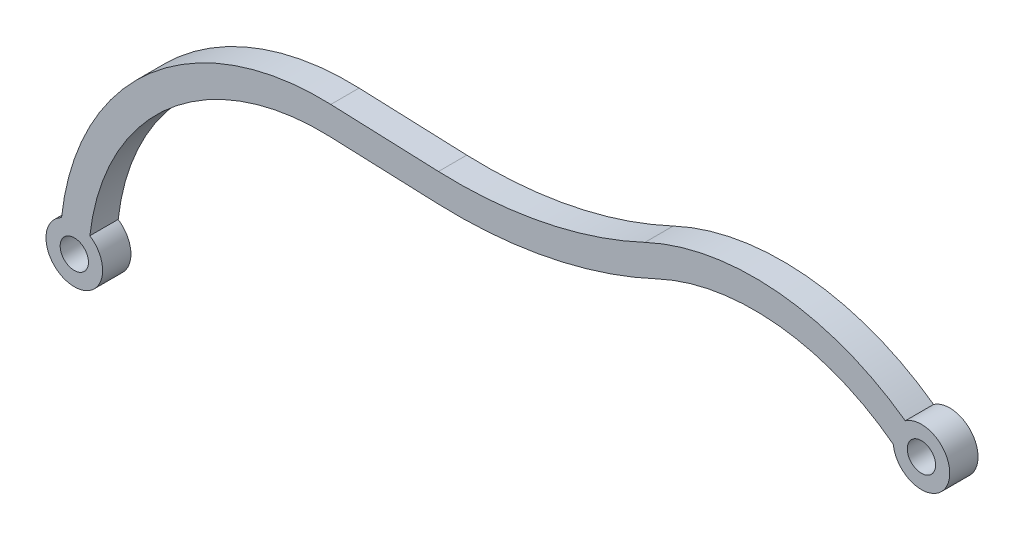
ISO-10303-21;
HEADER;
FILE_DESCRIPTION(('STEP AP214'),'2;1');
FILE_NAME('part.step','',(''),(''),'','','');
FILE_SCHEMA(('AUTOMOTIVE_DESIGN { 1 0 10303 214 1 1 1 1 }'));
ENDSEC;
DATA;
#1=APPLICATION_CONTEXT('core data for automotive mechanical design processes');
#2=APPLICATION_PROTOCOL_DEFINITION('international standard','automotive_design',2000,#1);
#3=PRODUCT_CONTEXT('',#1,'mechanical');
#4=PRODUCT('Part','Part','',(#3));
#5=PRODUCT_RELATED_PRODUCT_CATEGORY('part','',(#4));
#6=PRODUCT_DEFINITION_FORMATION('','',#4);
#7=PRODUCT_DEFINITION_CONTEXT('part definition',#1,'design');
#8=PRODUCT_DEFINITION('design','',#6,#7);
#9=PRODUCT_DEFINITION_SHAPE('','',#8);
#10=(LENGTH_UNIT() NAMED_UNIT(*) SI_UNIT(.MILLI.,.METRE.));
#11=(NAMED_UNIT(*) PLANE_ANGLE_UNIT() SI_UNIT($,.RADIAN.));
#12=(NAMED_UNIT(*) SI_UNIT($,.STERADIAN.) SOLID_ANGLE_UNIT());
#13=UNCERTAINTY_MEASURE_WITH_UNIT(LENGTH_MEASURE(1.E-05),#10,'distance_accuracy_value','');
#14=(GEOMETRIC_REPRESENTATION_CONTEXT(3) GLOBAL_UNCERTAINTY_ASSIGNED_CONTEXT((#13)) GLOBAL_UNIT_ASSIGNED_CONTEXT((#10,
#11,#12)) REPRESENTATION_CONTEXT('',''));
#15=CARTESIAN_POINT('',(0.,0.,0.));
#16=DIRECTION('',(0.,0.,1.));
#17=DIRECTION('',(1.,0.,0.));
#18=AXIS2_PLACEMENT_3D('',#15,#16,#17);
#19=CARTESIAN_POINT('',(-34.6964939459684,-9.74731730627593,3.));
#20=DIRECTION('',(0.,0.,-1.));
#21=DIRECTION('',(-1.,0.,0.));
#22=AXIS2_PLACEMENT_3D('',#19,#20,#21);
#23=CYLINDRICAL_SURFACE('',#22,24.3069426707607);
#24=CARTESIAN_POINT('',(-34.6964939459684,-9.74731730627593,0.));
#25=DIRECTION('',(0.,0.,1.));
#26=DIRECTION('',(1.,0.,0.));
#27=AXIS2_PLACEMENT_3D('',#24,#25,#26);
#28=CIRCLE('',#27,24.3069426707607);
#29=CARTESIAN_POINT('',(-45.0240765738917,12.2565118846414,0.));
#30=VERTEX_POINT('',#29);
#31=CARTESIAN_POINT('',(-19.9819689637994,9.59978109500304,0.));
#32=VERTEX_POINT('',#31);
#33=EDGE_CURVE('E153',#30,#32,#28,.F.);
#34=ORIENTED_EDGE('',*,*,#33,.T.);
#35=DIRECTION('',(0.,0.,-1.));
#36=VECTOR('',#35,1.);
#37=CARTESIAN_POINT('',(-19.9819689637994,9.59978109500304,3.));
#38=LINE('',#37,#36);
#39=CARTESIAN_POINT('',(-19.9819689637994,9.59978109500304,3.));
#40=VERTEX_POINT('',#39);
#41=EDGE_CURVE('E11',#40,#32,#38,.T.);
#42=ORIENTED_EDGE('',*,*,#41,.F.);
#43=CARTESIAN_POINT('',(-34.6964939459684,-9.74731730627593,3.));
#44=DIRECTION('',(0.,0.,1.));
#45=DIRECTION('',(1.,0.,0.));
#46=AXIS2_PLACEMENT_3D('',#43,#44,#45);
#47=CIRCLE('',#46,24.3069426707607);
#48=CARTESIAN_POINT('',(-45.0240765738917,12.2565118846414,3.));
#49=VERTEX_POINT('',#48);
#50=EDGE_CURVE('E182',#49,#40,#47,.F.);
#51=ORIENTED_EDGE('',*,*,#50,.F.);
#52=DIRECTION('',(0.,0.,-1.));
#53=VECTOR('',#52,1.);
#54=CARTESIAN_POINT('',(-45.0240765738917,12.2565118846414,3.));
#55=LINE('',#54,#53);
#56=EDGE_CURVE('E152',#49,#30,#55,.T.);
#57=ORIENTED_EDGE('',*,*,#56,.T.);
#58=EDGE_LOOP('',(#34,#42,#51,#57));
#59=FACE_BOUND('',#58,.T.);
#60=ADVANCED_FACE('F37',(#59),#23,.F.);
#61=CARTESIAN_POINT('',(-17.,9.92820323027552,3.));
#62=DIRECTION('',(0.,0.,-1.));
#63=DIRECTION('',(-1.,0.,0.));
#64=AXIS2_PLACEMENT_3D('',#61,#62,#63);
#65=CYLINDRICAL_SURFACE('',#64,3.);
#66=CARTESIAN_POINT('',(-17.,9.92820323027552,0.));
#67=DIRECTION('',(0.,0.,1.));
#68=DIRECTION('',(1.,0.,0.));
#69=AXIS2_PLACEMENT_3D('',#66,#67,#68);
#70=CIRCLE('',#69,3.);
#71=CARTESIAN_POINT('',(-18.7115723196987,12.39204579717,0.));
#72=VERTEX_POINT('',#71);
#73=EDGE_CURVE('E156',#32,#72,#70,.T.);
#74=ORIENTED_EDGE('',*,*,#73,.T.);
#75=DIRECTION('',(0.,0.,-1.));
#76=VECTOR('',#75,1.);
#77=CARTESIAN_POINT('',(-18.7115723196987,12.39204579717,3.));
#78=LINE('',#77,#76);
#79=CARTESIAN_POINT('',(-18.7115723196987,12.39204579717,3.));
#80=VERTEX_POINT('',#79);
#81=EDGE_CURVE('E45',#80,#72,#78,.T.);
#82=ORIENTED_EDGE('',*,*,#81,.F.);
#83=CARTESIAN_POINT('',(-17.,9.92820323027552,3.));
#84=DIRECTION('',(0.,0.,1.));
#85=DIRECTION('',(1.,0.,0.));
#86=AXIS2_PLACEMENT_3D('',#83,#84,#85);
#87=CIRCLE('',#86,3.);
#88=EDGE_CURVE('E102',#40,#80,#87,.T.);
#89=ORIENTED_EDGE('',*,*,#88,.F.);
#90=ORIENTED_EDGE('',*,*,#41,.T.);
#91=EDGE_LOOP('',(#74,#82,#89,#90));
#92=FACE_BOUND('',#91,.T.);
#93=ADVANCED_FACE('F199',(#92),#65,.T.);
#94=CARTESIAN_POINT('',(-34.6964939459684,-9.74731730627593,3.));
#95=DIRECTION('',(0.,0.,-1.));
#96=DIRECTION('',(-1.,0.,0.));
#97=AXIS2_PLACEMENT_3D('',#94,#95,#96);
#98=CYLINDRICAL_SURFACE('',#97,27.3069426707607);
#99=CARTESIAN_POINT('',(-34.6964939459684,-9.74731730627593,0.));
#100=DIRECTION('',(0.,0.,1.));
#101=DIRECTION('',(1.,0.,0.));
#102=AXIS2_PLACEMENT_3D('',#99,#100,#101);
#103=CIRCLE('',#102,27.3069426707607);
#104=CARTESIAN_POINT('',(-46.2987226000676,14.9722581003166,0.));
#105=VERTEX_POINT('',#104);
#106=EDGE_CURVE('E159',#105,#72,#103,.F.);
#107=ORIENTED_EDGE('',*,*,#106,.F.);
#108=DIRECTION('',(0.,0.,-1.));
#109=VECTOR('',#108,1.);
#110=CARTESIAN_POINT('',(-46.2987226000676,14.9722581003166,3.));
#111=LINE('',#110,#109);
#112=CARTESIAN_POINT('',(-46.2987226000676,14.9722581003166,3.));
#113=VERTEX_POINT('',#112);
#114=EDGE_CURVE('E192',#113,#105,#111,.T.);
#115=ORIENTED_EDGE('',*,*,#114,.F.);
#116=CARTESIAN_POINT('',(-34.6964939459684,-9.74731730627593,3.));
#117=DIRECTION('',(0.,0.,1.));
#118=DIRECTION('',(1.,0.,0.));
#119=AXIS2_PLACEMENT_3D('',#116,#117,#118);
#120=CIRCLE('',#119,27.3069426707607);
#121=EDGE_CURVE('E198',#113,#80,#120,.F.);
#122=ORIENTED_EDGE('',*,*,#121,.T.);
#123=ORIENTED_EDGE('',*,*,#81,.T.);
#124=EDGE_LOOP('',(#107,#115,#122,#123));
#125=FACE_BOUND('',#124,.T.);
#126=ADVANCED_FACE('F196',(#125),#98,.T.);
#127=CARTESIAN_POINT('',(-66.3313634510628,57.6535731194278,3.));
#128=DIRECTION('',(0.,0.,-1.));
#129=DIRECTION('',(-1.,0.,0.));
#130=AXIS2_PLACEMENT_3D('',#127,#128,#129);
#131=CYLINDRICAL_SURFACE('',#130,47.148715265907);
#132=CARTESIAN_POINT('',(-66.3313634510628,57.6535731194278,0.));
#133=DIRECTION('',(0.,0.,1.));
#134=DIRECTION('',(1.,0.,0.));
#135=AXIS2_PLACEMENT_3D('',#132,#133,#134);
#136=CIRCLE('',#135,47.148715265907);
#137=CARTESIAN_POINT('',(-68.1726197636002,10.5408240336749,0.));
#138=VERTEX_POINT('',#137);
#139=EDGE_CURVE('E162',#138,#105,#136,.T.);
#140=ORIENTED_EDGE('',*,*,#139,.F.);
#141=DIRECTION('',(0.,0.,-1.));
#142=VECTOR('',#141,1.);
#143=CARTESIAN_POINT('',(-68.1726197636002,10.5408240336749,3.));
#144=LINE('',#143,#142);
#145=CARTESIAN_POINT('',(-68.1726197636002,10.5408240336749,3.));
#146=VERTEX_POINT('',#145);
#147=EDGE_CURVE('E190',#146,#138,#144,.T.);
#148=ORIENTED_EDGE('',*,*,#147,.F.);
#149=CARTESIAN_POINT('',(-66.3313634510628,57.6535731194278,3.));
#150=DIRECTION('',(0.,0.,1.));
#151=DIRECTION('',(1.,0.,0.));
#152=AXIS2_PLACEMENT_3D('',#149,#150,#151);
#153=CIRCLE('',#152,47.148715265907);
#154=EDGE_CURVE('E211',#146,#113,#153,.T.);
#155=ORIENTED_EDGE('',*,*,#154,.T.);
#156=ORIENTED_EDGE('',*,*,#114,.T.);
#157=EDGE_LOOP('',(#140,#148,#155,#156));
#158=FACE_BOUND('',#157,.T.);
#159=ADVANCED_FACE('F208',(#158),#131,.F.);
#160=CARTESIAN_POINT('',(0.307359521282458,7.86449551140546,3.));
#161=DIRECTION('',(0.0390520993446631,0.999237175818021,0.));
#162=DIRECTION('',(-0.999237175818021,0.0390520993446631,0.));
#163=AXIS2_PLACEMENT_3D('',#160,#161,#162);
#164=PLANE('',#163);
#165=DIRECTION('',(0.999237175818021,-0.0390520993446631,0.));
#166=VECTOR('',#165,1.);
#167=CARTESIAN_POINT('',(0.307359521282458,7.86449551140546,0.));
#168=LINE('',#167,#166);
#169=CARTESIAN_POINT('',(-79.582404032337,10.9867402180874,0.));
#170=VERTEX_POINT('',#169);
#171=EDGE_CURVE('E165',#170,#138,#168,.T.);
#172=ORIENTED_EDGE('',*,*,#171,.F.);
#173=DIRECTION('',(0.,0.,-1.));
#174=VECTOR('',#173,1.);
#175=CARTESIAN_POINT('',(-79.582404032337,10.9867402180874,3.));
#176=LINE('',#175,#174);
#177=CARTESIAN_POINT('',(-79.582404032337,10.9867402180874,3.));
#178=VERTEX_POINT('',#177);
#179=EDGE_CURVE('E188',#178,#170,#176,.T.);
#180=ORIENTED_EDGE('',*,*,#179,.F.);
#181=DIRECTION('',(0.999237175818021,-0.0390520993446631,0.));
#182=VECTOR('',#181,1.);
#183=CARTESIAN_POINT('',(0.307359521282458,7.86449551140546,3.));
#184=LINE('',#183,#182);
#185=EDGE_CURVE('E215',#178,#146,#184,.T.);
#186=ORIENTED_EDGE('',*,*,#185,.T.);
#187=ORIENTED_EDGE('',*,*,#147,.T.);
#188=EDGE_LOOP('',(#172,#180,#186,#187));
#189=FACE_BOUND('',#188,.T.);
#190=ADVANCED_FACE('F227',(#189),#164,.T.);
#191=CARTESIAN_POINT('',(-80.6605611743525,-16.6003732983286,3.));
#192=DIRECTION('',(0.,0.,-1.));
#193=DIRECTION('',(-1.,0.,0.));
#194=AXIS2_PLACEMENT_3D('',#191,#192,#193);
#195=CYLINDRICAL_SURFACE('',#194,27.6081736989338);
#196=CARTESIAN_POINT('',(-80.6605611743525,-16.6003732983286,0.));
#197=DIRECTION('',(0.,0.,1.));
#198=DIRECTION('',(1.,0.,0.));
#199=AXIS2_PLACEMENT_3D('',#196,#197,#198);
#200=CIRCLE('',#199,27.6081736989338);
#201=CARTESIAN_POINT('',(-108.111857284869,-13.6613944206796,0.));
#202=VERTEX_POINT('',#201);
#203=EDGE_CURVE('E168',#202,#170,#200,.F.);
#204=ORIENTED_EDGE('',*,*,#203,.F.);
#205=DIRECTION('',(0.,0.,-1.));
#206=VECTOR('',#205,1.);
#207=CARTESIAN_POINT('',(-108.111857284869,-13.6613944206796,3.));
#208=LINE('',#207,#206);
#209=CARTESIAN_POINT('',(-108.111857284869,-13.6613944206796,3.));
#210=VERTEX_POINT('',#209);
#211=EDGE_CURVE('E186',#210,#202,#208,.T.);
#212=ORIENTED_EDGE('',*,*,#211,.F.);
#213=CARTESIAN_POINT('',(-80.6605611743525,-16.6003732983286,3.));
#214=DIRECTION('',(0.,0.,1.));
#215=DIRECTION('',(1.,0.,0.));
#216=AXIS2_PLACEMENT_3D('',#213,#214,#215);
#217=CIRCLE('',#216,27.6081736989338);
#218=EDGE_CURVE('E221',#210,#178,#217,.F.);
#219=ORIENTED_EDGE('',*,*,#218,.T.);
#220=ORIENTED_EDGE('',*,*,#179,.T.);
#221=EDGE_LOOP('',(#204,#212,#219,#220));
#222=FACE_BOUND('',#221,.T.);
#223=ADVANCED_FACE('F225',(#222),#195,.T.);
#224=CARTESIAN_POINT('',(-106.758866773324,-16.3389710630319,3.));
#225=DIRECTION('',(0.,0.,-1.));
#226=DIRECTION('',(-1.,0.,0.));
#227=AXIS2_PLACEMENT_3D('',#224,#225,#226);
#228=CYLINDRICAL_SURFACE('',#227,3.00000000000001);
#229=CARTESIAN_POINT('',(-106.758866773324,-16.3389710630319,0.));
#230=DIRECTION('',(0.,0.,1.));
#231=DIRECTION('',(1.,0.,0.));
#232=AXIS2_PLACEMENT_3D('',#229,#230,#231);
#233=CIRCLE('',#232,3.00000000000001);
#234=CARTESIAN_POINT('',(-105.112423115772,-13.8311386757888,0.));
#235=VERTEX_POINT('',#234);
#236=EDGE_CURVE('E171',#202,#235,#233,.T.);
#237=ORIENTED_EDGE('',*,*,#236,.T.);
#238=DIRECTION('',(0.,0.,-1.));
#239=VECTOR('',#238,1.);
#240=CARTESIAN_POINT('',(-105.112423115772,-13.8311386757888,3.));
#241=LINE('',#240,#239);
#242=CARTESIAN_POINT('',(-105.112423115772,-13.8311386757888,3.));
#243=VERTEX_POINT('',#242);
#244=EDGE_CURVE('E138',#243,#235,#241,.T.);
#245=ORIENTED_EDGE('',*,*,#244,.F.);
#246=CARTESIAN_POINT('',(-106.758866773324,-16.3389710630319,3.));
#247=DIRECTION('',(0.,0.,1.));
#248=DIRECTION('',(1.,0.,0.));
#249=AXIS2_PLACEMENT_3D('',#246,#247,#248);
#250=CIRCLE('',#249,3.00000000000001);
#251=EDGE_CURVE('E129',#210,#243,#250,.T.);
#252=ORIENTED_EDGE('',*,*,#251,.F.);
#253=ORIENTED_EDGE('',*,*,#211,.T.);
#254=EDGE_LOOP('',(#237,#245,#252,#253));
#255=FACE_BOUND('',#254,.T.);
#256=ADVANCED_FACE('F230',(#255),#228,.T.);
#257=CARTESIAN_POINT('',(-80.6605611743525,-16.6003732983286,3.));
#258=DIRECTION('',(0.,0.,-1.));
#259=DIRECTION('',(-1.,0.,0.));
#260=AXIS2_PLACEMENT_3D('',#257,#258,#259);
#261=CYLINDRICAL_SURFACE('',#260,24.6081736989338);
#262=CARTESIAN_POINT('',(-80.6605611743525,-16.6003732983286,0.));
#263=DIRECTION('',(0.,0.,1.));
#264=DIRECTION('',(1.,0.,0.));
#265=AXIS2_PLACEMENT_3D('',#262,#263,#264);
#266=CIRCLE('',#265,24.6081736989338);
#267=CARTESIAN_POINT('',(-79.699560330371,7.98902869063329,0.));
#268=VERTEX_POINT('',#267);
#269=EDGE_CURVE('E137',#235,#268,#266,.F.);
#270=ORIENTED_EDGE('',*,*,#269,.T.);
#271=DIRECTION('',(0.,0.,-1.));
#272=VECTOR('',#271,1.);
#273=CARTESIAN_POINT('',(-79.699560330371,7.98902869063329,3.));
#274=LINE('',#273,#272);
#275=CARTESIAN_POINT('',(-79.699560330371,7.98902869063329,3.));
#276=VERTEX_POINT('',#275);
#277=EDGE_CURVE('E134',#276,#268,#274,.T.);
#278=ORIENTED_EDGE('',*,*,#277,.F.);
#279=CARTESIAN_POINT('',(-80.6605611743525,-16.6003732983286,3.));
#280=DIRECTION('',(0.,0.,1.));
#281=DIRECTION('',(1.,0.,0.));
#282=AXIS2_PLACEMENT_3D('',#279,#280,#281);
#283=CIRCLE('',#282,24.6081736989338);
#284=EDGE_CURVE('E121',#243,#276,#283,.F.);
#285=ORIENTED_EDGE('',*,*,#284,.F.);
#286=ORIENTED_EDGE('',*,*,#244,.T.);
#287=EDGE_LOOP('',(#270,#278,#285,#286));
#288=FACE_BOUND('',#287,.T.);
#289=ADVANCED_FACE('F135',(#288),#261,.F.);
#290=CARTESIAN_POINT('',(0.190203223248469,4.86678398395141,3.));
#291=DIRECTION('',(0.0390520993446628,0.999237175818021,0.));
#292=DIRECTION('',(-0.999237175818021,0.0390520993446628,0.));
#293=AXIS2_PLACEMENT_3D('',#290,#291,#292);
#294=PLANE('',#293);
#295=DIRECTION('',(0.999237175818021,-0.0390520993446628,0.));
#296=VECTOR('',#295,1.);
#297=CARTESIAN_POINT('',(0.190203223248469,4.86678398395141,0.));
#298=LINE('',#297,#296);
#299=CARTESIAN_POINT('',(-68.2897760616342,7.54311250622081,0.));
#300=VERTEX_POINT('',#299);
#301=EDGE_CURVE('E88',#268,#300,#298,.T.);
#302=ORIENTED_EDGE('',*,*,#301,.T.);
#303=DIRECTION('',(0.,0.,-1.));
#304=VECTOR('',#303,1.);
#305=CARTESIAN_POINT('',(-68.2897760616342,7.54311250622081,3.));
#306=LINE('',#305,#304);
#307=CARTESIAN_POINT('',(-68.2897760616342,7.54311250622081,3.));
#308=VERTEX_POINT('',#307);
#309=EDGE_CURVE('E139',#308,#300,#306,.T.);
#310=ORIENTED_EDGE('',*,*,#309,.F.);
#311=DIRECTION('',(0.999237175818021,-0.0390520993446628,0.));
#312=VECTOR('',#311,1.);
#313=CARTESIAN_POINT('',(0.190203223248469,4.86678398395141,3.));
#314=LINE('',#313,#312);
#315=EDGE_CURVE('E126',#276,#308,#314,.T.);
#316=ORIENTED_EDGE('',*,*,#315,.F.);
#317=ORIENTED_EDGE('',*,*,#277,.T.);
#318=EDGE_LOOP('',(#302,#310,#316,#317));
#319=FACE_BOUND('',#318,.T.);
#320=ADVANCED_FACE('F141',(#319),#294,.F.);
#321=CARTESIAN_POINT('',(-106.758866773324,-16.3389710630319,3.));
#322=DIRECTION('',(0.,0.,-1.));
#323=DIRECTION('',(-1.,0.,0.));
#324=AXIS2_PLACEMENT_3D('',#321,#322,#323);
#325=CYLINDRICAL_SURFACE('',#324,1.5);
#326=CARTESIAN_POINT('',(-106.758866773324,-16.3389710630319,3.));
#327=DIRECTION('',(0.,0.,1.));
#328=DIRECTION('',(1.,0.,0.));
#329=AXIS2_PLACEMENT_3D('',#326,#327,#328);
#330=CIRCLE('',#329,1.5);
#331=CARTESIAN_POINT('',(-105.258866773324,-16.3389710630319,3.));
#332=VERTEX_POINT('',#331);
#333=EDGE_CURVE('E143',#332,#332,#330,.T.);
#334=ORIENTED_EDGE('',*,*,#333,.T.);
#335=EDGE_LOOP('',(#334));
#336=FACE_BOUND('',#335,.T.);
#337=CARTESIAN_POINT('',(-106.758866773324,-16.3389710630319,0.));
#338=DIRECTION('',(0.,0.,1.));
#339=DIRECTION('',(1.,0.,0.));
#340=AXIS2_PLACEMENT_3D('',#337,#338,#339);
#341=CIRCLE('',#340,1.5);
#342=CARTESIAN_POINT('',(-105.258866773324,-16.3389710630319,0.));
#343=VERTEX_POINT('',#342);
#344=EDGE_CURVE('E176',#343,#343,#341,.T.);
#345=ORIENTED_EDGE('',*,*,#344,.F.);
#346=EDGE_LOOP('',(#345));
#347=FACE_BOUND('',#346,.T.);
#348=ADVANCED_FACE('F248',(#336,#347),#325,.F.);
#349=CARTESIAN_POINT('',(-66.3313634510628,57.6535731194278,3.));
#350=DIRECTION('',(0.,0.,-1.));
#351=DIRECTION('',(-1.,0.,0.));
#352=AXIS2_PLACEMENT_3D('',#349,#350,#351);
#353=CYLINDRICAL_SURFACE('',#352,50.148715265907);
#354=CARTESIAN_POINT('',(-66.3313634510628,57.6535731194278,0.));
#355=DIRECTION('',(0.,0.,1.));
#356=DIRECTION('',(1.,0.,0.));
#357=AXIS2_PLACEMENT_3D('',#354,#355,#356);
#358=CIRCLE('',#357,50.148715265907);
#359=EDGE_CURVE('E94',#300,#30,#358,.T.);
#360=ORIENTED_EDGE('',*,*,#359,.T.);
#361=ORIENTED_EDGE('',*,*,#56,.F.);
#362=CARTESIAN_POINT('',(-66.3313634510628,57.6535731194278,3.));
#363=DIRECTION('',(0.,0.,1.));
#364=DIRECTION('',(1.,0.,0.));
#365=AXIS2_PLACEMENT_3D('',#362,#363,#364);
#366=CIRCLE('',#365,50.148715265907);
#367=EDGE_CURVE('E53',#308,#49,#366,.T.);
#368=ORIENTED_EDGE('',*,*,#367,.F.);
#369=ORIENTED_EDGE('',*,*,#309,.T.);
#370=EDGE_LOOP('',(#360,#361,#368,#369));
#371=FACE_BOUND('',#370,.T.);
#372=ADVANCED_FACE('F245',(#371),#353,.T.);
#373=CARTESIAN_POINT('',(-17.,9.92820323027552,3.));
#374=DIRECTION('',(0.,0.,-1.));
#375=DIRECTION('',(-1.,0.,0.));
#376=AXIS2_PLACEMENT_3D('',#373,#374,#375);
#377=CYLINDRICAL_SURFACE('',#376,1.5);
#378=CARTESIAN_POINT('',(-17.,9.92820323027552,3.));
#379=DIRECTION('',(0.,0.,1.));
#380=DIRECTION('',(1.,0.,0.));
#381=AXIS2_PLACEMENT_3D('',#378,#379,#380);
#382=CIRCLE('',#381,1.5);
#383=CARTESIAN_POINT('',(-15.5,9.92820323027552,3.));
#384=VERTEX_POINT('',#383);
#385=EDGE_CURVE('E149',#384,#384,#382,.T.);
#386=ORIENTED_EDGE('',*,*,#385,.T.);
#387=EDGE_LOOP('',(#386));
#388=FACE_BOUND('',#387,.T.);
#389=CARTESIAN_POINT('',(-17.,9.92820323027552,0.));
#390=DIRECTION('',(0.,0.,1.));
#391=DIRECTION('',(1.,0.,0.));
#392=AXIS2_PLACEMENT_3D('',#389,#390,#391);
#393=CIRCLE('',#392,1.5);
#394=CARTESIAN_POINT('',(-15.5,9.92820323027552,0.));
#395=VERTEX_POINT('',#394);
#396=EDGE_CURVE('E179',#395,#395,#393,.T.);
#397=ORIENTED_EDGE('',*,*,#396,.F.);
#398=EDGE_LOOP('',(#397));
#399=FACE_BOUND('',#398,.T.);
#400=ADVANCED_FACE('F247',(#388,#399),#377,.F.);
#401=CARTESIAN_POINT('',(0.,0.,3.));
#402=DIRECTION('',(0.,0.,1.));
#403=DIRECTION('',(1.,0.,0.));
#404=AXIS2_PLACEMENT_3D('',#401,#402,#403);
#405=PLANE('',#404);
#406=ORIENTED_EDGE('',*,*,#50,.T.);
#407=ORIENTED_EDGE('',*,*,#88,.T.);
#408=ORIENTED_EDGE('',*,*,#121,.F.);
#409=ORIENTED_EDGE('',*,*,#154,.F.);
#410=ORIENTED_EDGE('',*,*,#185,.F.);
#411=ORIENTED_EDGE('',*,*,#218,.F.);
#412=ORIENTED_EDGE('',*,*,#251,.T.);
#413=ORIENTED_EDGE('',*,*,#284,.T.);
#414=ORIENTED_EDGE('',*,*,#315,.T.);
#415=ORIENTED_EDGE('',*,*,#367,.T.);
#416=EDGE_LOOP('',(#406,#407,#408,#409,#410,#411,#412,#413,#414,#415));
#417=FACE_BOUND('',#416,.T.);
#418=ORIENTED_EDGE('',*,*,#333,.F.);
#419=EDGE_LOOP('',(#418));
#420=FACE_BOUND('',#419,.T.);
#421=ORIENTED_EDGE('',*,*,#385,.F.);
#422=EDGE_LOOP('',(#421));
#423=FACE_BOUND('',#422,.T.);
#424=ADVANCED_FACE('F123',(#417,#420,#423),#405,.T.);
#425=CARTESIAN_POINT('',(0.,0.,0.));
#426=DIRECTION('',(0.,0.,1.));
#427=DIRECTION('',(1.,0.,0.));
#428=AXIS2_PLACEMENT_3D('',#425,#426,#427);
#429=PLANE('',#428);
#430=ORIENTED_EDGE('',*,*,#33,.F.);
#431=ORIENTED_EDGE('',*,*,#359,.F.);
#432=ORIENTED_EDGE('',*,*,#301,.F.);
#433=ORIENTED_EDGE('',*,*,#269,.F.);
#434=ORIENTED_EDGE('',*,*,#236,.F.);
#435=ORIENTED_EDGE('',*,*,#203,.T.);
#436=ORIENTED_EDGE('',*,*,#171,.T.);
#437=ORIENTED_EDGE('',*,*,#139,.T.);
#438=ORIENTED_EDGE('',*,*,#106,.T.);
#439=ORIENTED_EDGE('',*,*,#73,.F.);
#440=EDGE_LOOP('',(#430,#431,#432,#433,#434,#435,#436,#437,#438,#439));
#441=FACE_BOUND('',#440,.T.);
#442=ORIENTED_EDGE('',*,*,#344,.T.);
#443=EDGE_LOOP('',(#442));
#444=FACE_BOUND('',#443,.T.);
#445=ORIENTED_EDGE('',*,*,#396,.T.);
#446=EDGE_LOOP('',(#445));
#447=FACE_BOUND('',#446,.T.);
#448=ADVANCED_FACE('F203',(#441,#444,#447),#429,.F.);
#449=CLOSED_SHELL('',(#60,#93,#126,#159,#190,#223,#256,#289,#320,#348,#372,#400,#424,#448));
#450=MANIFOLD_SOLID_BREP('B2',#449);
#451=ADVANCED_BREP_SHAPE_REPRESENTATION('',(#18,#450),#14);
#452=SHAPE_DEFINITION_REPRESENTATION(#9,#451);
ENDSEC;
END-ISO-10303-21;
